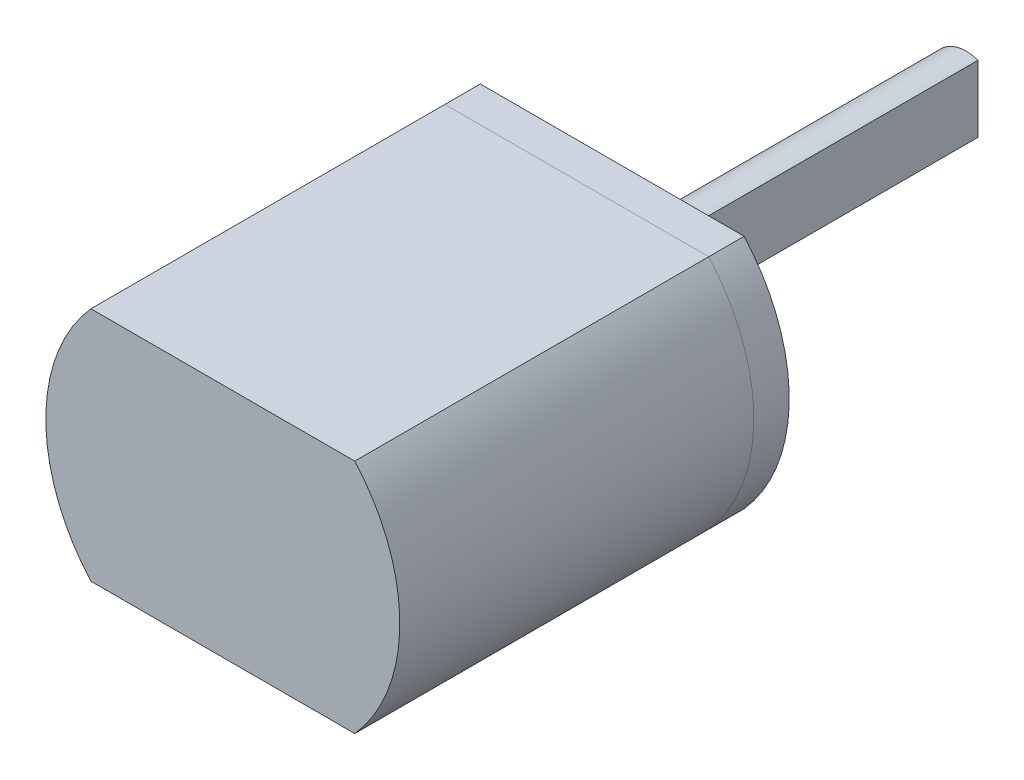
ISO-10303-21;
HEADER;
FILE_DESCRIPTION(('STEP AP214'),'2;1');
FILE_NAME('part.step','',(''),(''),'','','');
FILE_SCHEMA(('AUTOMOTIVE_DESIGN { 1 0 10303 214 1 1 1 1 }'));
ENDSEC;
DATA;
#1=APPLICATION_CONTEXT('core data for automotive mechanical design processes');
#2=APPLICATION_PROTOCOL_DEFINITION('international standard','automotive_design',2000,#1);
#3=PRODUCT_CONTEXT('',#1,'mechanical');
#4=PRODUCT('Part','Part','',(#3));
#5=PRODUCT_RELATED_PRODUCT_CATEGORY('part','',(#4));
#6=PRODUCT_DEFINITION_FORMATION('','',#4);
#7=PRODUCT_DEFINITION_CONTEXT('part definition',#1,'design');
#8=PRODUCT_DEFINITION('design','',#6,#7);
#9=PRODUCT_DEFINITION_SHAPE('','',#8);
#10=(LENGTH_UNIT() NAMED_UNIT(*) SI_UNIT(.MILLI.,.METRE.));
#11=(NAMED_UNIT(*) PLANE_ANGLE_UNIT() SI_UNIT($,.RADIAN.));
#12=(NAMED_UNIT(*) SI_UNIT($,.STERADIAN.) SOLID_ANGLE_UNIT());
#13=UNCERTAINTY_MEASURE_WITH_UNIT(LENGTH_MEASURE(1.E-05),#10,'distance_accuracy_value','');
#14=(GEOMETRIC_REPRESENTATION_CONTEXT(3) GLOBAL_UNCERTAINTY_ASSIGNED_CONTEXT((#13)) GLOBAL_UNIT_ASSIGNED_CONTEXT((#10,
#11,#12)) REPRESENTATION_CONTEXT('',''));
#15=CARTESIAN_POINT('',(0.,0.,0.));
#16=DIRECTION('',(0.,0.,1.));
#17=DIRECTION('',(1.,0.,0.));
#18=AXIS2_PLACEMENT_3D('',#15,#16,#17);
#19=CARTESIAN_POINT('',(0.,0.,-1.5));
#20=DIRECTION('',(0.,0.,1.));
#21=DIRECTION('',(1.,0.,0.));
#22=AXIS2_PLACEMENT_3D('',#19,#20,#21);
#23=CYLINDRICAL_SURFACE('',#22,7.5);
#24=CARTESIAN_POINT('',(0.,0.,0.));
#25=DIRECTION('',(0.,0.,-1.));
#26=DIRECTION('',(-1.,0.,0.));
#27=AXIS2_PLACEMENT_3D('',#24,#25,#26);
#28=CIRCLE('',#27,7.5);
#29=CARTESIAN_POINT('',(-5.59016994374948,-5.,0.));
#30=VERTEX_POINT('',#29);
#31=CARTESIAN_POINT('',(-5.59016994374947,5.,0.));
#32=VERTEX_POINT('',#31);
#33=EDGE_CURVE('E122',#30,#32,#28,.T.);
#34=ORIENTED_EDGE('',*,*,#33,.T.);
#35=DIRECTION('',(0.,0.,1.));
#36=VECTOR('',#35,1.);
#37=CARTESIAN_POINT('',(-5.59016994374947,5.,-1.5));
#38=LINE('',#37,#36);
#39=CARTESIAN_POINT('',(-5.59016994374947,5.,-1.5));
#40=VERTEX_POINT('',#39);
#41=EDGE_CURVE('E12',#40,#32,#38,.T.);
#42=ORIENTED_EDGE('',*,*,#41,.F.);
#43=CARTESIAN_POINT('',(0.,0.,-1.5));
#44=DIRECTION('',(0.,0.,-1.));
#45=DIRECTION('',(-1.,0.,0.));
#46=AXIS2_PLACEMENT_3D('',#43,#44,#45);
#47=CIRCLE('',#46,7.5);
#48=CARTESIAN_POINT('',(-5.59016994374948,-5.,-1.5));
#49=VERTEX_POINT('',#48);
#50=EDGE_CURVE('E130',#49,#40,#47,.T.);
#51=ORIENTED_EDGE('',*,*,#50,.F.);
#52=DIRECTION('',(0.,0.,1.));
#53=VECTOR('',#52,1.);
#54=CARTESIAN_POINT('',(-5.59016994374948,-5.,-1.5));
#55=LINE('',#54,#53);
#56=EDGE_CURVE('E135',#49,#30,#55,.T.);
#57=ORIENTED_EDGE('',*,*,#56,.T.);
#58=EDGE_LOOP('',(#34,#42,#51,#57));
#59=FACE_BOUND('',#58,.T.);
#60=ADVANCED_FACE('F45',(#59),#23,.T.);
#61=CARTESIAN_POINT('',(5.59016994374947,5.,-1.5));
#62=DIRECTION('',(0.,-1.,0.));
#63=DIRECTION('',(1.,0.,0.));
#64=AXIS2_PLACEMENT_3D('',#61,#62,#63);
#65=PLANE('',#64);
#66=DIRECTION('',(1.,0.,0.));
#67=VECTOR('',#66,1.);
#68=CARTESIAN_POINT('',(5.59016994374947,5.,0.));
#69=LINE('',#68,#67);
#70=CARTESIAN_POINT('',(5.59016994374947,5.,0.));
#71=VERTEX_POINT('',#70);
#72=EDGE_CURVE('E125',#32,#71,#69,.T.);
#73=ORIENTED_EDGE('',*,*,#72,.T.);
#74=DIRECTION('',(0.,0.,1.));
#75=VECTOR('',#74,1.);
#76=CARTESIAN_POINT('',(5.59016994374947,5.,-1.5));
#77=LINE('',#76,#75);
#78=CARTESIAN_POINT('',(5.59016994374947,5.,-1.5));
#79=VERTEX_POINT('',#78);
#80=EDGE_CURVE('E52',#79,#71,#77,.T.);
#81=ORIENTED_EDGE('',*,*,#80,.F.);
#82=DIRECTION('',(1.,0.,0.));
#83=VECTOR('',#82,1.);
#84=CARTESIAN_POINT('',(5.59016994374947,5.,-1.5));
#85=LINE('',#84,#83);
#86=EDGE_CURVE('E95',#40,#79,#85,.T.);
#87=ORIENTED_EDGE('',*,*,#86,.F.);
#88=ORIENTED_EDGE('',*,*,#41,.T.);
#89=EDGE_LOOP('',(#73,#81,#87,#88));
#90=FACE_BOUND('',#89,.T.);
#91=ADVANCED_FACE('F165',(#90),#65,.F.);
#92=CARTESIAN_POINT('',(0.,0.,-1.5));
#93=DIRECTION('',(0.,0.,1.));
#94=DIRECTION('',(1.,0.,0.));
#95=AXIS2_PLACEMENT_3D('',#92,#93,#94);
#96=CYLINDRICAL_SURFACE('',#95,7.5);
#97=CARTESIAN_POINT('',(0.,0.,0.));
#98=DIRECTION('',(0.,0.,-1.));
#99=DIRECTION('',(-1.,0.,0.));
#100=AXIS2_PLACEMENT_3D('',#97,#98,#99);
#101=CIRCLE('',#100,7.5);
#102=CARTESIAN_POINT('',(5.59016994374948,-5.,0.));
#103=VERTEX_POINT('',#102);
#104=EDGE_CURVE('E138',#71,#103,#101,.T.);
#105=ORIENTED_EDGE('',*,*,#104,.T.);
#106=DIRECTION('',(0.,0.,1.));
#107=VECTOR('',#106,1.);
#108=CARTESIAN_POINT('',(5.59016994374948,-5.,-1.5));
#109=LINE('',#108,#107);
#110=CARTESIAN_POINT('',(5.59016994374948,-5.,-1.5));
#111=VERTEX_POINT('',#110);
#112=EDGE_CURVE('E142',#111,#103,#109,.T.);
#113=ORIENTED_EDGE('',*,*,#112,.F.);
#114=CARTESIAN_POINT('',(0.,0.,-1.5));
#115=DIRECTION('',(0.,0.,-1.));
#116=DIRECTION('',(-1.,0.,0.));
#117=AXIS2_PLACEMENT_3D('',#114,#115,#116);
#118=CIRCLE('',#117,7.5);
#119=EDGE_CURVE('E133',#79,#111,#118,.T.);
#120=ORIENTED_EDGE('',*,*,#119,.F.);
#121=ORIENTED_EDGE('',*,*,#80,.T.);
#122=EDGE_LOOP('',(#105,#113,#120,#121));
#123=FACE_BOUND('',#122,.T.);
#124=ADVANCED_FACE('F147',(#123),#96,.T.);
#125=CARTESIAN_POINT('',(-5.59016994374948,-5.,-1.5));
#126=DIRECTION('',(0.,1.,0.));
#127=DIRECTION('',(0.,0.,1.));
#128=AXIS2_PLACEMENT_3D('',#125,#126,#127);
#129=PLANE('',#128);
#130=DIRECTION('',(-1.,0.,0.));
#131=VECTOR('',#130,1.);
#132=CARTESIAN_POINT('',(-5.59016994374948,-5.,0.));
#133=LINE('',#132,#131);
#134=EDGE_CURVE('E88',#103,#30,#133,.T.);
#135=ORIENTED_EDGE('',*,*,#134,.T.);
#136=ORIENTED_EDGE('',*,*,#56,.F.);
#137=DIRECTION('',(-1.,0.,0.));
#138=VECTOR('',#137,1.);
#139=CARTESIAN_POINT('',(-5.59016994374948,-5.,-1.5));
#140=LINE('',#139,#138);
#141=EDGE_CURVE('E67',#111,#49,#140,.T.);
#142=ORIENTED_EDGE('',*,*,#141,.F.);
#143=ORIENTED_EDGE('',*,*,#112,.T.);
#144=EDGE_LOOP('',(#135,#136,#142,#143));
#145=FACE_BOUND('',#144,.T.);
#146=ADVANCED_FACE('F155',(#145),#129,.F.);
#147=CARTESIAN_POINT('',(0.,0.,-1.5));
#148=DIRECTION('',(0.,0.,-1.));
#149=DIRECTION('',(-1.,0.,0.));
#150=AXIS2_PLACEMENT_3D('',#147,#148,#149);
#151=PLANE('',#150);
#152=CARTESIAN_POINT('',(0.,0.,-1.5));
#153=DIRECTION('',(0.,0.,-1.));
#154=DIRECTION('',(-1.,0.,0.));
#155=AXIS2_PLACEMENT_3D('',#152,#153,#154);
#156=CIRCLE('',#155,1.5);
#157=CARTESIAN_POINT('',(0.499999999999999,-1.4142135623731,-1.5));
#158=VERTEX_POINT('',#157);
#159=CARTESIAN_POINT('',(0.499999999999999,1.4142135623731,-1.5));
#160=VERTEX_POINT('',#159);
#161=EDGE_CURVE('E121',#158,#160,#156,.T.);
#162=ORIENTED_EDGE('',*,*,#161,.F.);
#163=DIRECTION('',(0.,-1.,0.));
#164=VECTOR('',#163,1.);
#165=CARTESIAN_POINT('',(0.499999999999999,-1.4142135623731,-1.5));
#166=LINE('',#165,#164);
#167=EDGE_CURVE('E58',#160,#158,#166,.T.);
#168=ORIENTED_EDGE('',*,*,#167,.F.);
#169=EDGE_LOOP('',(#162,#168));
#170=FACE_BOUND('',#169,.T.);
#171=ORIENTED_EDGE('',*,*,#50,.T.);
#172=ORIENTED_EDGE('',*,*,#86,.T.);
#173=ORIENTED_EDGE('',*,*,#119,.T.);
#174=ORIENTED_EDGE('',*,*,#141,.T.);
#175=EDGE_LOOP('',(#171,#172,#173,#174));
#176=FACE_BOUND('',#175,.T.);
#177=ADVANCED_FACE('F157',(#170,#176),#151,.T.);
#178=CARTESIAN_POINT('',(0.,0.,0.));
#179=DIRECTION('',(0.,0.,-1.));
#180=DIRECTION('',(-1.,0.,0.));
#181=AXIS2_PLACEMENT_3D('',#178,#179,#180);
#182=PLANE('',#181);
#183=ORIENTED_EDGE('',*,*,#33,.F.);
#184=ORIENTED_EDGE('',*,*,#134,.F.);
#185=ORIENTED_EDGE('',*,*,#104,.F.);
#186=ORIENTED_EDGE('',*,*,#72,.F.);
#187=EDGE_LOOP('',(#183,#184,#185,#186));
#188=FACE_BOUND('',#187,.T.);
#189=ADVANCED_FACE('F151',(#188),#182,.F.);
#190=CARTESIAN_POINT('',(0.,0.,-16.5));
#191=DIRECTION('',(0.,0.,1.));
#192=DIRECTION('',(1.,0.,0.));
#193=AXIS2_PLACEMENT_3D('',#190,#191,#192);
#194=CYLINDRICAL_SURFACE('',#193,1.5);
#195=ORIENTED_EDGE('',*,*,#161,.T.);
#196=DIRECTION('',(0.,0.,1.));
#197=VECTOR('',#196,1.);
#198=CARTESIAN_POINT('',(0.499999999999999,1.4142135623731,-16.5));
#199=LINE('',#198,#197);
#200=CARTESIAN_POINT('',(0.499999999999999,1.4142135623731,-16.5));
#201=VERTEX_POINT('',#200);
#202=EDGE_CURVE('E109',#201,#160,#199,.T.);
#203=ORIENTED_EDGE('',*,*,#202,.F.);
#204=CARTESIAN_POINT('',(0.,0.,-16.5));
#205=DIRECTION('',(0.,0.,-1.));
#206=DIRECTION('',(-1.,0.,0.));
#207=AXIS2_PLACEMENT_3D('',#204,#205,#206);
#208=CIRCLE('',#207,1.5);
#209=CARTESIAN_POINT('',(0.499999999999999,-1.4142135623731,-16.5));
#210=VERTEX_POINT('',#209);
#211=EDGE_CURVE('E115',#210,#201,#208,.T.);
#212=ORIENTED_EDGE('',*,*,#211,.F.);
#213=DIRECTION('',(0.,0.,1.));
#214=VECTOR('',#213,1.);
#215=CARTESIAN_POINT('',(0.499999999999999,-1.4142135623731,-16.5));
#216=LINE('',#215,#214);
#217=EDGE_CURVE('E112',#210,#158,#216,.T.);
#218=ORIENTED_EDGE('',*,*,#217,.T.);
#219=EDGE_LOOP('',(#195,#203,#212,#218));
#220=FACE_BOUND('',#219,.T.);
#221=ADVANCED_FACE('F120',(#220),#194,.T.);
#222=CARTESIAN_POINT('',(0.499999999999999,-1.4142135623731,-16.5));
#223=DIRECTION('',(-1.,0.,0.));
#224=DIRECTION('',(0.,0.,1.));
#225=AXIS2_PLACEMENT_3D('',#222,#223,#224);
#226=PLANE('',#225);
#227=ORIENTED_EDGE('',*,*,#167,.T.);
#228=ORIENTED_EDGE('',*,*,#217,.F.);
#229=DIRECTION('',(0.,-1.,0.));
#230=VECTOR('',#229,1.);
#231=CARTESIAN_POINT('',(0.499999999999999,-1.4142135623731,-16.5));
#232=LINE('',#231,#230);
#233=EDGE_CURVE('E105',#201,#210,#232,.T.);
#234=ORIENTED_EDGE('',*,*,#233,.F.);
#235=ORIENTED_EDGE('',*,*,#202,.T.);
#236=EDGE_LOOP('',(#227,#228,#234,#235));
#237=FACE_BOUND('',#236,.T.);
#238=ADVANCED_FACE('F107',(#237),#226,.F.);
#239=CARTESIAN_POINT('',(0.,0.,-16.5));
#240=DIRECTION('',(0.,0.,-1.));
#241=DIRECTION('',(-1.,0.,0.));
#242=AXIS2_PLACEMENT_3D('',#239,#240,#241);
#243=PLANE('',#242);
#244=ORIENTED_EDGE('',*,*,#211,.T.);
#245=ORIENTED_EDGE('',*,*,#233,.T.);
#246=EDGE_LOOP('',(#244,#245));
#247=FACE_BOUND('',#246,.T.);
#248=ADVANCED_FACE('F117',(#247),#243,.T.);
#249=CLOSED_SHELL('',(#60,#91,#124,#146,#177,#189,#221,#238,#248));
#250=MANIFOLD_SOLID_BREP('B2',#249);
#251=CARTESIAN_POINT('',(0.,0.,15.));
#252=DIRECTION('',(0.,0.,-1.));
#253=DIRECTION('',(-1.,0.,0.));
#254=AXIS2_PLACEMENT_3D('',#251,#252,#253);
#255=CYLINDRICAL_SURFACE('',#254,7.5);
#256=CARTESIAN_POINT('',(0.,0.,0.));
#257=DIRECTION('',(0.,0.,1.));
#258=DIRECTION('',(1.,0.,0.));
#259=AXIS2_PLACEMENT_3D('',#256,#257,#258);
#260=CIRCLE('',#259,7.5);
#261=CARTESIAN_POINT('',(-5.59016994374947,5.,0.));
#262=VERTEX_POINT('',#261);
#263=CARTESIAN_POINT('',(-5.59016994374948,-5.,0.));
#264=VERTEX_POINT('',#263);
#265=EDGE_CURVE('E304',#262,#264,#260,.T.);
#266=ORIENTED_EDGE('',*,*,#265,.T.);
#267=DIRECTION('',(0.,0.,-1.));
#268=VECTOR('',#267,1.);
#269=CARTESIAN_POINT('',(-5.59016994374948,-5.,15.));
#270=LINE('',#269,#268);
#271=CARTESIAN_POINT('',(-5.59016994374948,-5.,15.));
#272=VERTEX_POINT('',#271);
#273=EDGE_CURVE('E43',#272,#264,#270,.T.);
#274=ORIENTED_EDGE('',*,*,#273,.F.);
#275=CARTESIAN_POINT('',(0.,0.,15.));
#276=DIRECTION('',(0.,0.,1.));
#277=DIRECTION('',(1.,0.,0.));
#278=AXIS2_PLACEMENT_3D('',#275,#276,#277);
#279=CIRCLE('',#278,7.5);
#280=CARTESIAN_POINT('',(-5.59016994374947,5.,15.));
#281=VERTEX_POINT('',#280);
#282=EDGE_CURVE('E292',#281,#272,#279,.T.);
#283=ORIENTED_EDGE('',*,*,#282,.F.);
#284=DIRECTION('',(0.,0.,-1.));
#285=VECTOR('',#284,1.);
#286=CARTESIAN_POINT('',(-5.59016994374947,5.,15.));
#287=LINE('',#286,#285);
#288=EDGE_CURVE('E300',#281,#262,#287,.T.);
#289=ORIENTED_EDGE('',*,*,#288,.T.);
#290=EDGE_LOOP('',(#266,#274,#283,#289));
#291=FACE_BOUND('',#290,.T.);
#292=ADVANCED_FACE('F241',(#291),#255,.T.);
#293=CARTESIAN_POINT('',(-5.59016994374948,-5.,15.));
#294=DIRECTION('',(0.,1.,0.));
#295=DIRECTION('',(0.,0.,1.));
#296=AXIS2_PLACEMENT_3D('',#293,#294,#295);
#297=PLANE('',#296);
#298=DIRECTION('',(1.,0.,0.));
#299=VECTOR('',#298,1.);
#300=CARTESIAN_POINT('',(-5.59016994374948,-5.,0.));
#301=LINE('',#300,#299);
#302=CARTESIAN_POINT('',(5.59016994374948,-5.,0.));
#303=VERTEX_POINT('',#302);
#304=EDGE_CURVE('E296',#264,#303,#301,.T.);
#305=ORIENTED_EDGE('',*,*,#304,.T.);
#306=DIRECTION('',(0.,0.,-1.));
#307=VECTOR('',#306,1.);
#308=CARTESIAN_POINT('',(5.59016994374948,-5.,15.));
#309=LINE('',#308,#307);
#310=CARTESIAN_POINT('',(5.59016994374948,-5.,15.));
#311=VERTEX_POINT('',#310);
#312=EDGE_CURVE('E249',#311,#303,#309,.T.);
#313=ORIENTED_EDGE('',*,*,#312,.F.);
#314=DIRECTION('',(1.,0.,0.));
#315=VECTOR('',#314,1.);
#316=CARTESIAN_POINT('',(-5.59016994374948,-5.,15.));
#317=LINE('',#316,#315);
#318=EDGE_CURVE('E287',#272,#311,#317,.T.);
#319=ORIENTED_EDGE('',*,*,#318,.F.);
#320=ORIENTED_EDGE('',*,*,#273,.T.);
#321=EDGE_LOOP('',(#305,#313,#319,#320));
#322=FACE_BOUND('',#321,.T.);
#323=ADVANCED_FACE('F295',(#322),#297,.F.);
#324=CARTESIAN_POINT('',(0.,0.,15.));
#325=DIRECTION('',(0.,0.,-1.));
#326=DIRECTION('',(-1.,0.,0.));
#327=AXIS2_PLACEMENT_3D('',#324,#325,#326);
#328=CYLINDRICAL_SURFACE('',#327,7.5);
#329=CARTESIAN_POINT('',(0.,0.,0.));
#330=DIRECTION('',(0.,0.,1.));
#331=DIRECTION('',(1.,0.,0.));
#332=AXIS2_PLACEMENT_3D('',#329,#330,#331);
#333=CIRCLE('',#332,7.5);
#334=CARTESIAN_POINT('',(5.59016994374947,5.,0.));
#335=VERTEX_POINT('',#334);
#336=EDGE_CURVE('E274',#303,#335,#333,.T.);
#337=ORIENTED_EDGE('',*,*,#336,.T.);
#338=DIRECTION('',(0.,0.,-1.));
#339=VECTOR('',#338,1.);
#340=CARTESIAN_POINT('',(5.59016994374947,5.,15.));
#341=LINE('',#340,#339);
#342=CARTESIAN_POINT('',(5.59016994374947,5.,15.));
#343=VERTEX_POINT('',#342);
#344=EDGE_CURVE('E297',#343,#335,#341,.T.);
#345=ORIENTED_EDGE('',*,*,#344,.F.);
#346=CARTESIAN_POINT('',(0.,0.,15.));
#347=DIRECTION('',(0.,0.,1.));
#348=DIRECTION('',(1.,0.,0.));
#349=AXIS2_PLACEMENT_3D('',#346,#347,#348);
#350=CIRCLE('',#349,7.5);
#351=EDGE_CURVE('E290',#311,#343,#350,.T.);
#352=ORIENTED_EDGE('',*,*,#351,.F.);
#353=ORIENTED_EDGE('',*,*,#312,.T.);
#354=EDGE_LOOP('',(#337,#345,#352,#353));
#355=FACE_BOUND('',#354,.T.);
#356=ADVANCED_FACE('F298',(#355),#328,.T.);
#357=CARTESIAN_POINT('',(-5.59016994374947,5.,15.));
#358=DIRECTION('',(0.,-1.,0.));
#359=DIRECTION('',(0.,0.,-1.));
#360=AXIS2_PLACEMENT_3D('',#357,#358,#359);
#361=PLANE('',#360);
#362=DIRECTION('',(-1.,0.,0.));
#363=VECTOR('',#362,1.);
#364=CARTESIAN_POINT('',(-5.59016994374947,5.,0.));
#365=LINE('',#364,#363);
#366=EDGE_CURVE('E280',#335,#262,#365,.T.);
#367=ORIENTED_EDGE('',*,*,#366,.T.);
#368=ORIENTED_EDGE('',*,*,#288,.F.);
#369=DIRECTION('',(-1.,0.,0.));
#370=VECTOR('',#369,1.);
#371=CARTESIAN_POINT('',(-5.59016994374947,5.,15.));
#372=LINE('',#371,#370);
#373=EDGE_CURVE('E257',#343,#281,#372,.T.);
#374=ORIENTED_EDGE('',*,*,#373,.F.);
#375=ORIENTED_EDGE('',*,*,#344,.T.);
#376=EDGE_LOOP('',(#367,#368,#374,#375));
#377=FACE_BOUND('',#376,.T.);
#378=ADVANCED_FACE('F311',(#377),#361,.F.);
#379=CARTESIAN_POINT('',(0.,0.,15.));
#380=DIRECTION('',(0.,0.,1.));
#381=DIRECTION('',(1.,0.,0.));
#382=AXIS2_PLACEMENT_3D('',#379,#380,#381);
#383=PLANE('',#382);
#384=ORIENTED_EDGE('',*,*,#282,.T.);
#385=ORIENTED_EDGE('',*,*,#318,.T.);
#386=ORIENTED_EDGE('',*,*,#351,.T.);
#387=ORIENTED_EDGE('',*,*,#373,.T.);
#388=EDGE_LOOP('',(#384,#385,#386,#387));
#389=FACE_BOUND('',#388,.T.);
#390=ADVANCED_FACE('F288',(#389),#383,.T.);
#391=CARTESIAN_POINT('',(0.,0.,0.));
#392=DIRECTION('',(0.,0.,1.));
#393=DIRECTION('',(1.,0.,0.));
#394=AXIS2_PLACEMENT_3D('',#391,#392,#393);
#395=PLANE('',#394);
#396=ORIENTED_EDGE('',*,*,#265,.F.);
#397=ORIENTED_EDGE('',*,*,#366,.F.);
#398=ORIENTED_EDGE('',*,*,#336,.F.);
#399=ORIENTED_EDGE('',*,*,#304,.F.);
#400=EDGE_LOOP('',(#396,#397,#398,#399));
#401=FACE_BOUND('',#400,.T.);
#402=ADVANCED_FACE('F314',(#401),#395,.F.);
#403=CLOSED_SHELL('',(#292,#323,#356,#378,#390,#402));
#404=MANIFOLD_SOLID_BREP('B6',#403);
#405=ADVANCED_BREP_SHAPE_REPRESENTATION('',(#18,#250,#404),#14);
#406=SHAPE_DEFINITION_REPRESENTATION(#9,#405);
ENDSEC;
END-ISO-10303-21;
